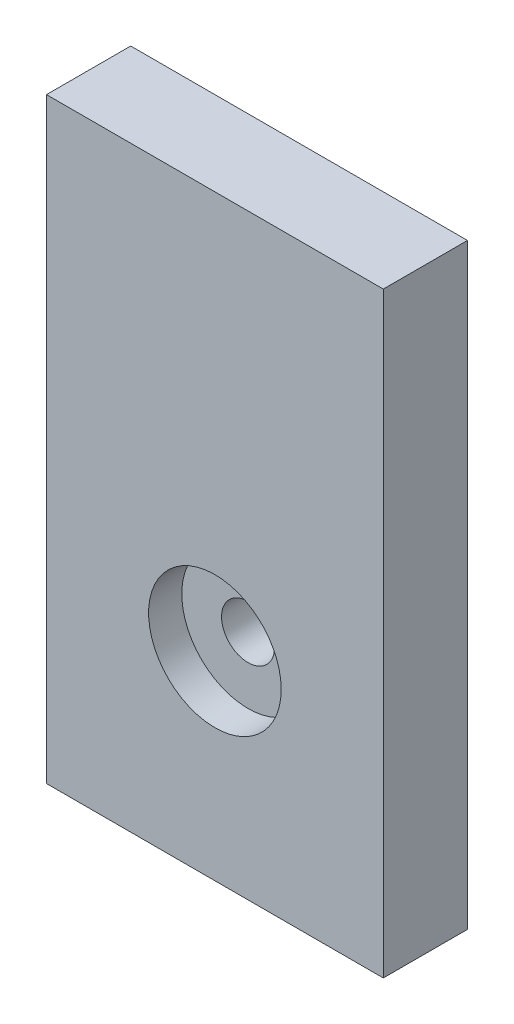
ISO-10303-21;
HEADER;
FILE_DESCRIPTION(('STEP AP214'),'2;1');
FILE_NAME('part.step','',(''),(''),'','','');
FILE_SCHEMA(('AUTOMOTIVE_DESIGN { 1 0 10303 214 1 1 1 1 }'));
ENDSEC;
DATA;
#1=APPLICATION_CONTEXT('core data for automotive mechanical design processes');
#2=APPLICATION_PROTOCOL_DEFINITION('international standard','automotive_design',2000,#1);
#3=PRODUCT_CONTEXT('',#1,'mechanical');
#4=PRODUCT('Part','Part','',(#3));
#5=PRODUCT_RELATED_PRODUCT_CATEGORY('part','',(#4));
#6=PRODUCT_DEFINITION_FORMATION('','',#4);
#7=PRODUCT_DEFINITION_CONTEXT('part definition',#1,'design');
#8=PRODUCT_DEFINITION('design','',#6,#7);
#9=PRODUCT_DEFINITION_SHAPE('','',#8);
#10=(LENGTH_UNIT() NAMED_UNIT(*) SI_UNIT(.MILLI.,.METRE.));
#11=(NAMED_UNIT(*) PLANE_ANGLE_UNIT() SI_UNIT($,.RADIAN.));
#12=(NAMED_UNIT(*) SI_UNIT($,.STERADIAN.) SOLID_ANGLE_UNIT());
#13=UNCERTAINTY_MEASURE_WITH_UNIT(LENGTH_MEASURE(1.E-05),#10,'distance_accuracy_value','');
#14=(GEOMETRIC_REPRESENTATION_CONTEXT(3) GLOBAL_UNCERTAINTY_ASSIGNED_CONTEXT((#13)) GLOBAL_UNIT_ASSIGNED_CONTEXT((#10,
#11,#12)) REPRESENTATION_CONTEXT('',''));
#15=CARTESIAN_POINT('',(0.,0.,0.));
#16=DIRECTION('',(0.,0.,1.));
#17=DIRECTION('',(1.,0.,0.));
#18=AXIS2_PLACEMENT_3D('',#15,#16,#17);
#19=CARTESIAN_POINT('',(0.,-20.,12.7));
#20=DIRECTION('',(0.,0.,-1.));
#21=DIRECTION('',(-1.,0.,0.));
#22=AXIS2_PLACEMENT_3D('',#19,#20,#21);
#23=CYLINDRICAL_SURFACE('',#22,4.);
#24=CARTESIAN_POINT('',(0.,-20.,0.));
#25=DIRECTION('',(0.,0.,1.));
#26=DIRECTION('',(1.,0.,0.));
#27=AXIS2_PLACEMENT_3D('',#24,#25,#26);
#28=CIRCLE('',#27,4.);
#29=CARTESIAN_POINT('',(4.,-20.,0.));
#30=VERTEX_POINT('',#29);
#31=EDGE_CURVE('E86',#30,#30,#28,.T.);
#32=ORIENTED_EDGE('',*,*,#31,.F.);
#33=EDGE_LOOP('',(#32));
#34=FACE_BOUND('',#33,.T.);
#35=CARTESIAN_POINT('',(0.,-20.,7.7));
#36=DIRECTION('',(0.,0.,1.));
#37=DIRECTION('',(1.,0.,0.));
#38=AXIS2_PLACEMENT_3D('',#35,#36,#37);
#39=CIRCLE('',#38,4.);
#40=CARTESIAN_POINT('',(4.,-20.,7.7));
#41=VERTEX_POINT('',#40);
#42=EDGE_CURVE('E37',#41,#41,#39,.T.);
#43=ORIENTED_EDGE('',*,*,#42,.T.);
#44=EDGE_LOOP('',(#43));
#45=FACE_BOUND('',#44,.T.);
#46=ADVANCED_FACE('F33',(#34,#45),#23,.F.);
#47=CARTESIAN_POINT('',(0.,0.,12.7));
#48=DIRECTION('',(0.,0.,1.));
#49=DIRECTION('',(1.,0.,0.));
#50=AXIS2_PLACEMENT_3D('',#47,#48,#49);
#51=PLANE('',#50);
#52=CARTESIAN_POINT('',(0.,-20.,12.7));
#53=DIRECTION('',(0.,0.,1.));
#54=DIRECTION('',(1.,0.,0.));
#55=AXIS2_PLACEMENT_3D('',#52,#53,#54);
#56=CIRCLE('',#55,10.);
#57=CARTESIAN_POINT('',(10.,-20.,12.7));
#58=VERTEX_POINT('',#57);
#59=EDGE_CURVE('E102',#58,#58,#56,.T.);
#60=ORIENTED_EDGE('',*,*,#59,.F.);
#61=EDGE_LOOP('',(#60));
#62=FACE_BOUND('',#61,.T.);
#63=DIRECTION('',(0.,-1.,0.));
#64=VECTOR('',#63,1.);
#65=CARTESIAN_POINT('',(-25.4,-40.,12.7));
#66=LINE('',#65,#64);
#67=CARTESIAN_POINT('',(-25.4,40.,12.7));
#68=VERTEX_POINT('',#67);
#69=CARTESIAN_POINT('',(-25.4,-50.,12.7));
#70=VERTEX_POINT('',#69);
#71=EDGE_CURVE('E67',#68,#70,#66,.T.);
#72=ORIENTED_EDGE('',*,*,#71,.T.);
#73=DIRECTION('',(-1.,0.,0.));
#74=VECTOR('',#73,1.);
#75=CARTESIAN_POINT('',(25.4,-50.,12.7));
#76=LINE('',#75,#74);
#77=CARTESIAN_POINT('',(25.4,-50.,12.7));
#78=VERTEX_POINT('',#77);
#79=EDGE_CURVE('E97',#78,#70,#76,.T.);
#80=ORIENTED_EDGE('',*,*,#79,.F.);
#81=DIRECTION('',(0.,1.,0.));
#82=VECTOR('',#81,1.);
#83=CARTESIAN_POINT('',(25.4,-40.,12.7));
#84=LINE('',#83,#82);
#85=CARTESIAN_POINT('',(25.4,40.,12.7));
#86=VERTEX_POINT('',#85);
#87=EDGE_CURVE('E111',#78,#86,#84,.T.);
#88=ORIENTED_EDGE('',*,*,#87,.T.);
#89=DIRECTION('',(-1.,0.,0.));
#90=VECTOR('',#89,1.);
#91=CARTESIAN_POINT('',(25.4,40.,12.7));
#92=LINE('',#91,#90);
#93=EDGE_CURVE('E51',#86,#68,#92,.T.);
#94=ORIENTED_EDGE('',*,*,#93,.T.);
#95=EDGE_LOOP('',(#72,#80,#88,#94));
#96=FACE_BOUND('',#95,.T.);
#97=ADVANCED_FACE('F120',(#62,#96),#51,.T.);
#98=CARTESIAN_POINT('',(0.,0.,0.));
#99=DIRECTION('',(0.,0.,1.));
#100=DIRECTION('',(1.,0.,0.));
#101=AXIS2_PLACEMENT_3D('',#98,#99,#100);
#102=PLANE('',#101);
#103=DIRECTION('',(0.,-1.,0.));
#104=VECTOR('',#103,1.);
#105=CARTESIAN_POINT('',(-25.4,-40.,0.));
#106=LINE('',#105,#104);
#107=CARTESIAN_POINT('',(-25.4,40.,0.));
#108=VERTEX_POINT('',#107);
#109=CARTESIAN_POINT('',(-25.4,-50.,0.));
#110=VERTEX_POINT('',#109);
#111=EDGE_CURVE('E80',#108,#110,#106,.T.);
#112=ORIENTED_EDGE('',*,*,#111,.F.);
#113=DIRECTION('',(-1.,0.,0.));
#114=VECTOR('',#113,1.);
#115=CARTESIAN_POINT('',(25.4,40.,0.));
#116=LINE('',#115,#114);
#117=CARTESIAN_POINT('',(25.4,40.,0.));
#118=VERTEX_POINT('',#117);
#119=EDGE_CURVE('E112',#118,#108,#116,.T.);
#120=ORIENTED_EDGE('',*,*,#119,.F.);
#121=DIRECTION('',(0.,1.,0.));
#122=VECTOR('',#121,1.);
#123=CARTESIAN_POINT('',(25.4,-40.,0.));
#124=LINE('',#123,#122);
#125=CARTESIAN_POINT('',(25.4,-50.,0.));
#126=VERTEX_POINT('',#125);
#127=EDGE_CURVE('E62',#126,#118,#124,.T.);
#128=ORIENTED_EDGE('',*,*,#127,.F.);
#129=DIRECTION('',(1.,0.,0.));
#130=VECTOR('',#129,1.);
#131=CARTESIAN_POINT('',(-25.4,-50.,0.));
#132=LINE('',#131,#130);
#133=EDGE_CURVE('E89',#110,#126,#132,.T.);
#134=ORIENTED_EDGE('',*,*,#133,.F.);
#135=EDGE_LOOP('',(#112,#120,#128,#134));
#136=FACE_BOUND('',#135,.T.);
#137=ORIENTED_EDGE('',*,*,#31,.T.);
#138=EDGE_LOOP('',(#137));
#139=FACE_BOUND('',#138,.T.);
#140=ADVANCED_FACE('F90',(#136,#139),#102,.F.);
#141=CARTESIAN_POINT('',(-25.4,-40.,12.7));
#142=DIRECTION('',(1.,0.,0.));
#143=DIRECTION('',(0.,0.,-1.));
#144=AXIS2_PLACEMENT_3D('',#141,#142,#143);
#145=PLANE('',#144);
#146=ORIENTED_EDGE('',*,*,#111,.T.);
#147=DIRECTION('',(0.,0.,-1.));
#148=VECTOR('',#147,1.);
#149=CARTESIAN_POINT('',(-25.4,-50.,12.7));
#150=LINE('',#149,#148);
#151=EDGE_CURVE('E83',#70,#110,#150,.T.);
#152=ORIENTED_EDGE('',*,*,#151,.F.);
#153=ORIENTED_EDGE('',*,*,#71,.F.);
#154=DIRECTION('',(0.,0.,-1.));
#155=VECTOR('',#154,1.);
#156=CARTESIAN_POINT('',(-25.4,40.,12.7));
#157=LINE('',#156,#155);
#158=EDGE_CURVE('E43',#68,#108,#157,.T.);
#159=ORIENTED_EDGE('',*,*,#158,.T.);
#160=EDGE_LOOP('',(#146,#152,#153,#159));
#161=FACE_BOUND('',#160,.T.);
#162=ADVANCED_FACE('F35',(#161),#145,.F.);
#163=CARTESIAN_POINT('',(25.4,-40.,12.7));
#164=DIRECTION('',(-1.,0.,0.));
#165=DIRECTION('',(0.,0.,1.));
#166=AXIS2_PLACEMENT_3D('',#163,#164,#165);
#167=PLANE('',#166);
#168=ORIENTED_EDGE('',*,*,#127,.T.);
#169=DIRECTION('',(0.,0.,-1.));
#170=VECTOR('',#169,1.);
#171=CARTESIAN_POINT('',(25.4,40.,12.7));
#172=LINE('',#171,#170);
#173=EDGE_CURVE('E11',#86,#118,#172,.T.);
#174=ORIENTED_EDGE('',*,*,#173,.F.);
#175=ORIENTED_EDGE('',*,*,#87,.F.);
#176=DIRECTION('',(0.,0.,1.));
#177=VECTOR('',#176,1.);
#178=CARTESIAN_POINT('',(25.4,-50.,0.));
#179=LINE('',#178,#177);
#180=EDGE_CURVE('E94',#126,#78,#179,.T.);
#181=ORIENTED_EDGE('',*,*,#180,.F.);
#182=EDGE_LOOP('',(#168,#174,#175,#181));
#183=FACE_BOUND('',#182,.T.);
#184=ADVANCED_FACE('F119',(#183),#167,.F.);
#185=CARTESIAN_POINT('',(25.4,40.,12.7));
#186=DIRECTION('',(0.,-1.,0.));
#187=DIRECTION('',(1.,0.,0.));
#188=AXIS2_PLACEMENT_3D('',#185,#186,#187);
#189=PLANE('',#188);
#190=ORIENTED_EDGE('',*,*,#119,.T.);
#191=ORIENTED_EDGE('',*,*,#158,.F.);
#192=ORIENTED_EDGE('',*,*,#93,.F.);
#193=ORIENTED_EDGE('',*,*,#173,.T.);
#194=EDGE_LOOP('',(#190,#191,#192,#193));
#195=FACE_BOUND('',#194,.T.);
#196=ADVANCED_FACE('F118',(#195),#189,.F.);
#197=CARTESIAN_POINT('',(0.,-20.,7.7));
#198=DIRECTION('',(0.,0.,1.));
#199=DIRECTION('',(1.,0.,0.));
#200=AXIS2_PLACEMENT_3D('',#197,#198,#199);
#201=CYLINDRICAL_SURFACE('',#200,10.);
#202=CARTESIAN_POINT('',(0.,-20.,7.7));
#203=DIRECTION('',(0.,0.,1.));
#204=DIRECTION('',(1.,0.,0.));
#205=AXIS2_PLACEMENT_3D('',#202,#203,#204);
#206=CIRCLE('',#205,10.);
#207=CARTESIAN_POINT('',(10.,-20.,7.7));
#208=VERTEX_POINT('',#207);
#209=EDGE_CURVE('E103',#208,#208,#206,.T.);
#210=ORIENTED_EDGE('',*,*,#209,.F.);
#211=EDGE_LOOP('',(#210));
#212=FACE_BOUND('',#211,.T.);
#213=ORIENTED_EDGE('',*,*,#59,.T.);
#214=EDGE_LOOP('',(#213));
#215=FACE_BOUND('',#214,.T.);
#216=ADVANCED_FACE('F135',(#212,#215),#201,.F.);
#217=CARTESIAN_POINT('',(0.,-20.,7.7));
#218=DIRECTION('',(0.,0.,1.));
#219=DIRECTION('',(1.,0.,0.));
#220=AXIS2_PLACEMENT_3D('',#217,#218,#219);
#221=PLANE('',#220);
#222=ORIENTED_EDGE('',*,*,#42,.F.);
#223=EDGE_LOOP('',(#222));
#224=FACE_BOUND('',#223,.T.);
#225=ORIENTED_EDGE('',*,*,#209,.T.);
#226=EDGE_LOOP('',(#225));
#227=FACE_BOUND('',#226,.T.);
#228=ADVANCED_FACE('F158',(#224,#227),#221,.T.);
#229=CARTESIAN_POINT('',(0.,-50.,0.));
#230=DIRECTION('',(0.,-1.,0.));
#231=DIRECTION('',(1.,0.,0.));
#232=AXIS2_PLACEMENT_3D('',#229,#230,#231);
#233=PLANE('',#232);
#234=ORIENTED_EDGE('',*,*,#151,.T.);
#235=ORIENTED_EDGE('',*,*,#133,.T.);
#236=ORIENTED_EDGE('',*,*,#180,.T.);
#237=ORIENTED_EDGE('',*,*,#79,.T.);
#238=EDGE_LOOP('',(#234,#235,#236,#237));
#239=FACE_BOUND('',#238,.T.);
#240=ADVANCED_FACE('F96',(#239),#233,.T.);
#241=CLOSED_SHELL('',(#46,#97,#140,#162,#184,#196,#216,#228,#240));
#242=MANIFOLD_SOLID_BREP('B2',#241);
#243=ADVANCED_BREP_SHAPE_REPRESENTATION('',(#18,#242),#14);
#244=SHAPE_DEFINITION_REPRESENTATION(#9,#243);
ENDSEC;
END-ISO-10303-21;
